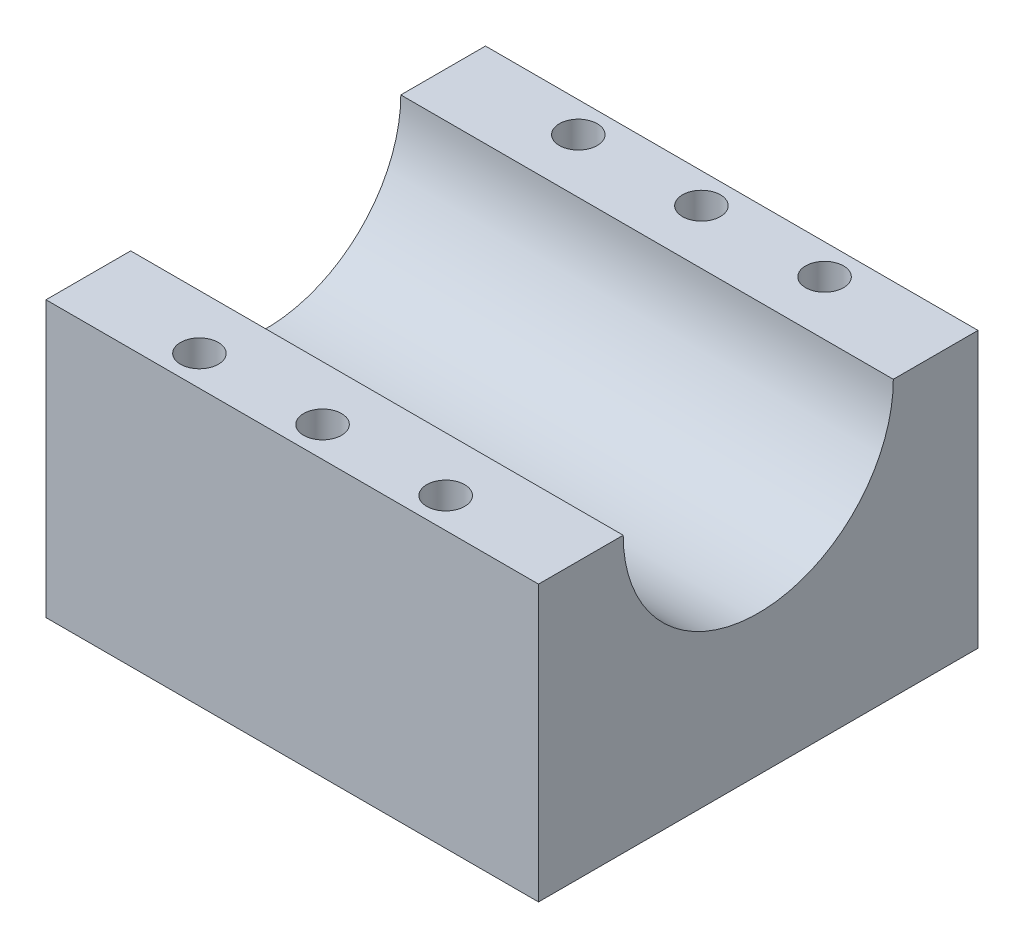
ISO-10303-21;
HEADER;
FILE_DESCRIPTION(('STEP AP214'),'2;1');
FILE_NAME('part.step','',(''),(''),'','','');
FILE_SCHEMA(('AUTOMOTIVE_DESIGN { 1 0 10303 214 1 1 1 1 }'));
ENDSEC;
DATA;
#1=APPLICATION_CONTEXT('core data for automotive mechanical design processes');
#2=APPLICATION_PROTOCOL_DEFINITION('international standard','automotive_design',2000,#1);
#3=PRODUCT_CONTEXT('',#1,'mechanical');
#4=PRODUCT('Part','Part','',(#3));
#5=PRODUCT_RELATED_PRODUCT_CATEGORY('part','',(#4));
#6=PRODUCT_DEFINITION_FORMATION('','',#4);
#7=PRODUCT_DEFINITION_CONTEXT('part definition',#1,'design');
#8=PRODUCT_DEFINITION('design','',#6,#7);
#9=PRODUCT_DEFINITION_SHAPE('','',#8);
#10=(LENGTH_UNIT() NAMED_UNIT(*) SI_UNIT(.MILLI.,.METRE.));
#11=(NAMED_UNIT(*) PLANE_ANGLE_UNIT() SI_UNIT($,.RADIAN.));
#12=(NAMED_UNIT(*) SI_UNIT($,.STERADIAN.) SOLID_ANGLE_UNIT());
#13=UNCERTAINTY_MEASURE_WITH_UNIT(LENGTH_MEASURE(1.E-05),#10,'distance_accuracy_value','');
#14=(GEOMETRIC_REPRESENTATION_CONTEXT(3) GLOBAL_UNCERTAINTY_ASSIGNED_CONTEXT((#13)) GLOBAL_UNIT_ASSIGNED_CONTEXT((#10,
#11,#12)) REPRESENTATION_CONTEXT('',''));
#15=CARTESIAN_POINT('',(0.,0.,0.));
#16=DIRECTION('',(0.,0.,1.));
#17=DIRECTION('',(1.,0.,0.));
#18=AXIS2_PLACEMENT_3D('',#15,#16,#17);
#19=CARTESIAN_POINT('',(0.,36.33,0.));
#20=DIRECTION('',(0.,-1.,0.));
#21=DIRECTION('',(0.,0.,-1.));
#22=AXIS2_PLACEMENT_3D('',#19,#20,#21);
#23=PLANE('',#22);
#24=CARTESIAN_POINT('',(0.,36.33,-25.));
#25=DIRECTION('',(0.,1.,0.));
#26=DIRECTION('',(0.,0.,1.));
#27=AXIS2_PLACEMENT_3D('',#24,#25,#26);
#28=CIRCLE('',#27,2.5);
#29=CARTESIAN_POINT('',(0.,36.33,-22.5));
#30=VERTEX_POINT('',#29);
#31=EDGE_CURVE('E170',#30,#30,#28,.T.);
#32=ORIENTED_EDGE('',*,*,#31,.F.);
#33=EDGE_LOOP('',(#32));
#34=FACE_BOUND('',#33,.T.);
#35=CARTESIAN_POINT('',(16.25,36.33,-25.));
#36=DIRECTION('',(0.,1.,0.));
#37=DIRECTION('',(0.,0.,1.));
#38=AXIS2_PLACEMENT_3D('',#35,#36,#37);
#39=CIRCLE('',#38,2.5);
#40=CARTESIAN_POINT('',(16.25,36.33,-22.5));
#41=VERTEX_POINT('',#40);
#42=EDGE_CURVE('E152',#41,#41,#39,.T.);
#43=ORIENTED_EDGE('',*,*,#42,.F.);
#44=EDGE_LOOP('',(#43));
#45=FACE_BOUND('',#44,.T.);
#46=CARTESIAN_POINT('',(-16.25,36.33,-25.));
#47=DIRECTION('',(0.,1.,0.));
#48=DIRECTION('',(0.,0.,1.));
#49=AXIS2_PLACEMENT_3D('',#46,#47,#48);
#50=CIRCLE('',#49,2.5);
#51=CARTESIAN_POINT('',(-16.25,36.33,-22.5));
#52=VERTEX_POINT('',#51);
#53=EDGE_CURVE('E127',#52,#52,#50,.T.);
#54=ORIENTED_EDGE('',*,*,#53,.F.);
#55=EDGE_LOOP('',(#54));
#56=FACE_BOUND('',#55,.T.);
#57=DIRECTION('',(0.,0.,1.));
#58=VECTOR('',#57,1.);
#59=CARTESIAN_POINT('',(-32.5,36.33,29.));
#60=LINE('',#59,#58);
#61=CARTESIAN_POINT('',(-32.5,36.33,-29.));
#62=VERTEX_POINT('',#61);
#63=CARTESIAN_POINT('',(-32.5,36.33,-17.825));
#64=VERTEX_POINT('',#63);
#65=EDGE_CURVE('E115',#62,#64,#60,.T.);
#66=ORIENTED_EDGE('',*,*,#65,.T.);
#67=DIRECTION('',(1.,0.,0.));
#68=VECTOR('',#67,1.);
#69=CARTESIAN_POINT('',(-32.5,36.33,-17.825));
#70=LINE('',#69,#68);
#71=CARTESIAN_POINT('',(32.5,36.33,-17.825));
#72=VERTEX_POINT('',#71);
#73=EDGE_CURVE('E53',#64,#72,#70,.T.);
#74=ORIENTED_EDGE('',*,*,#73,.T.);
#75=DIRECTION('',(0.,0.,-1.));
#76=VECTOR('',#75,1.);
#77=CARTESIAN_POINT('',(32.5,36.33,29.));
#78=LINE('',#77,#76);
#79=CARTESIAN_POINT('',(32.5,36.33,-29.));
#80=VERTEX_POINT('',#79);
#81=EDGE_CURVE('E89',#72,#80,#78,.T.);
#82=ORIENTED_EDGE('',*,*,#81,.T.);
#83=DIRECTION('',(-1.,0.,0.));
#84=VECTOR('',#83,1.);
#85=CARTESIAN_POINT('',(-32.5,36.33,-29.));
#86=LINE('',#85,#84);
#87=EDGE_CURVE('E116',#80,#62,#86,.T.);
#88=ORIENTED_EDGE('',*,*,#87,.T.);
#89=EDGE_LOOP('',(#66,#74,#82,#88));
#90=FACE_BOUND('',#89,.T.);
#91=ADVANCED_FACE('F38',(#34,#45,#56,#90),#23,.F.);
#92=CARTESIAN_POINT('',(32.5,36.33,29.));
#93=VERTEX_POINT('',#92);
#94=CARTESIAN_POINT('',(32.5,36.33,17.825));
#95=VERTEX_POINT('',#94);
#96=EDGE_CURVE('E110',#93,#95,#78,.T.);
#97=ORIENTED_EDGE('',*,*,#96,.T.);
#98=DIRECTION('',(1.,0.,0.));
#99=VECTOR('',#98,1.);
#100=CARTESIAN_POINT('',(-32.5,36.33,17.825));
#101=LINE('',#100,#99);
#102=CARTESIAN_POINT('',(-32.5,36.33,17.825));
#103=VERTEX_POINT('',#102);
#104=EDGE_CURVE('E99',#95,#103,#101,.F.);
#105=ORIENTED_EDGE('',*,*,#104,.T.);
#106=CARTESIAN_POINT('',(-32.5,36.33,29.));
#107=VERTEX_POINT('',#106);
#108=EDGE_CURVE('E107',#103,#107,#60,.T.);
#109=ORIENTED_EDGE('',*,*,#108,.T.);
#110=DIRECTION('',(1.,0.,0.));
#111=VECTOR('',#110,1.);
#112=CARTESIAN_POINT('',(-32.5,36.33,29.));
#113=LINE('',#112,#111);
#114=EDGE_CURVE('E61',#107,#93,#113,.T.);
#115=ORIENTED_EDGE('',*,*,#114,.T.);
#116=EDGE_LOOP('',(#97,#105,#109,#115));
#117=FACE_BOUND('',#116,.T.);
#118=CARTESIAN_POINT('',(16.25,36.33,25.));
#119=DIRECTION('',(0.,1.,0.));
#120=DIRECTION('',(0.,0.,-1.));
#121=AXIS2_PLACEMENT_3D('',#118,#119,#120);
#122=CIRCLE('',#121,2.5);
#123=CARTESIAN_POINT('',(16.25,36.33,22.5));
#124=VERTEX_POINT('',#123);
#125=EDGE_CURVE('E158',#124,#124,#122,.T.);
#126=ORIENTED_EDGE('',*,*,#125,.F.);
#127=EDGE_LOOP('',(#126));
#128=FACE_BOUND('',#127,.T.);
#129=CARTESIAN_POINT('',(-16.25,36.33,25.));
#130=DIRECTION('',(0.,1.,0.));
#131=DIRECTION('',(0.,0.,-1.));
#132=AXIS2_PLACEMENT_3D('',#129,#130,#131);
#133=CIRCLE('',#132,2.5);
#134=CARTESIAN_POINT('',(-16.25,36.33,22.5));
#135=VERTEX_POINT('',#134);
#136=EDGE_CURVE('E164',#135,#135,#133,.T.);
#137=ORIENTED_EDGE('',*,*,#136,.F.);
#138=EDGE_LOOP('',(#137));
#139=FACE_BOUND('',#138,.T.);
#140=CARTESIAN_POINT('',(0.,36.33,25.));
#141=DIRECTION('',(0.,1.,0.));
#142=DIRECTION('',(0.,0.,1.));
#143=AXIS2_PLACEMENT_3D('',#140,#141,#142);
#144=CIRCLE('',#143,2.5);
#145=CARTESIAN_POINT('',(0.,36.33,27.5));
#146=VERTEX_POINT('',#145);
#147=EDGE_CURVE('E176',#146,#146,#144,.T.);
#148=ORIENTED_EDGE('',*,*,#147,.F.);
#149=EDGE_LOOP('',(#148));
#150=FACE_BOUND('',#149,.T.);
#151=ADVANCED_FACE('F105',(#117,#128,#139,#150),#23,.F.);
#152=CARTESIAN_POINT('',(0.,0.,0.));
#153=DIRECTION('',(0.,-1.,0.));
#154=DIRECTION('',(0.,0.,-1.));
#155=AXIS2_PLACEMENT_3D('',#152,#153,#154);
#156=PLANE('',#155);
#157=CARTESIAN_POINT('',(0.,0.,-25.));
#158=DIRECTION('',(0.,1.,0.));
#159=DIRECTION('',(0.,0.,1.));
#160=AXIS2_PLACEMENT_3D('',#157,#158,#159);
#161=CIRCLE('',#160,2.5);
#162=CARTESIAN_POINT('',(0.,0.,-22.5));
#163=VERTEX_POINT('',#162);
#164=EDGE_CURVE('E173',#163,#163,#161,.T.);
#165=ORIENTED_EDGE('',*,*,#164,.T.);
#166=EDGE_LOOP('',(#165));
#167=FACE_BOUND('',#166,.T.);
#168=CARTESIAN_POINT('',(16.25,0.,25.));
#169=DIRECTION('',(0.,1.,0.));
#170=DIRECTION('',(0.,0.,-1.));
#171=AXIS2_PLACEMENT_3D('',#168,#169,#170);
#172=CIRCLE('',#171,2.5);
#173=CARTESIAN_POINT('',(16.25,0.,22.5));
#174=VERTEX_POINT('',#173);
#175=EDGE_CURVE('E161',#174,#174,#172,.T.);
#176=ORIENTED_EDGE('',*,*,#175,.T.);
#177=EDGE_LOOP('',(#176));
#178=FACE_BOUND('',#177,.T.);
#179=CARTESIAN_POINT('',(-16.25,0.,-25.));
#180=DIRECTION('',(0.,1.,0.));
#181=DIRECTION('',(0.,0.,1.));
#182=AXIS2_PLACEMENT_3D('',#179,#180,#181);
#183=CIRCLE('',#182,2.5);
#184=CARTESIAN_POINT('',(-16.25,0.,-22.5));
#185=VERTEX_POINT('',#184);
#186=EDGE_CURVE('E149',#185,#185,#183,.T.);
#187=ORIENTED_EDGE('',*,*,#186,.T.);
#188=EDGE_LOOP('',(#187));
#189=FACE_BOUND('',#188,.T.);
#190=DIRECTION('',(0.,0.,-1.));
#191=VECTOR('',#190,1.);
#192=CARTESIAN_POINT('',(32.5,0.,29.));
#193=LINE('',#192,#191);
#194=CARTESIAN_POINT('',(32.5,0.,29.));
#195=VERTEX_POINT('',#194);
#196=CARTESIAN_POINT('',(32.5,0.,-29.));
#197=VERTEX_POINT('',#196);
#198=EDGE_CURVE('E123',#195,#197,#193,.T.);
#199=ORIENTED_EDGE('',*,*,#198,.F.);
#200=DIRECTION('',(1.,0.,0.));
#201=VECTOR('',#200,1.);
#202=CARTESIAN_POINT('',(-32.5,0.,29.));
#203=LINE('',#202,#201);
#204=CARTESIAN_POINT('',(-32.5,0.,29.));
#205=VERTEX_POINT('',#204);
#206=EDGE_CURVE('E82',#205,#195,#203,.T.);
#207=ORIENTED_EDGE('',*,*,#206,.F.);
#208=DIRECTION('',(0.,0.,1.));
#209=VECTOR('',#208,1.);
#210=CARTESIAN_POINT('',(-32.5,0.,29.));
#211=LINE('',#210,#209);
#212=CARTESIAN_POINT('',(-32.5,0.,-29.));
#213=VERTEX_POINT('',#212);
#214=EDGE_CURVE('E129',#213,#205,#211,.T.);
#215=ORIENTED_EDGE('',*,*,#214,.F.);
#216=DIRECTION('',(-1.,0.,0.));
#217=VECTOR('',#216,1.);
#218=CARTESIAN_POINT('',(-32.5,0.,-29.));
#219=LINE('',#218,#217);
#220=EDGE_CURVE('E126',#197,#213,#219,.T.);
#221=ORIENTED_EDGE('',*,*,#220,.F.);
#222=EDGE_LOOP('',(#199,#207,#215,#221));
#223=FACE_BOUND('',#222,.T.);
#224=CARTESIAN_POINT('',(16.25,0.,-25.));
#225=DIRECTION('',(0.,1.,0.));
#226=DIRECTION('',(0.,0.,1.));
#227=AXIS2_PLACEMENT_3D('',#224,#225,#226);
#228=CIRCLE('',#227,2.5);
#229=CARTESIAN_POINT('',(16.25,0.,-22.5));
#230=VERTEX_POINT('',#229);
#231=EDGE_CURVE('E155',#230,#230,#228,.T.);
#232=ORIENTED_EDGE('',*,*,#231,.T.);
#233=EDGE_LOOP('',(#232));
#234=FACE_BOUND('',#233,.T.);
#235=CARTESIAN_POINT('',(-16.25,0.,25.));
#236=DIRECTION('',(0.,1.,0.));
#237=DIRECTION('',(0.,0.,-1.));
#238=AXIS2_PLACEMENT_3D('',#235,#236,#237);
#239=CIRCLE('',#238,2.5);
#240=CARTESIAN_POINT('',(-16.25,0.,22.5));
#241=VERTEX_POINT('',#240);
#242=EDGE_CURVE('E167',#241,#241,#239,.T.);
#243=ORIENTED_EDGE('',*,*,#242,.T.);
#244=EDGE_LOOP('',(#243));
#245=FACE_BOUND('',#244,.T.);
#246=CARTESIAN_POINT('',(0.,0.,25.));
#247=DIRECTION('',(0.,1.,0.));
#248=DIRECTION('',(0.,0.,1.));
#249=AXIS2_PLACEMENT_3D('',#246,#247,#248);
#250=CIRCLE('',#249,2.5);
#251=CARTESIAN_POINT('',(0.,0.,27.5));
#252=VERTEX_POINT('',#251);
#253=EDGE_CURVE('E179',#252,#252,#250,.T.);
#254=ORIENTED_EDGE('',*,*,#253,.T.);
#255=EDGE_LOOP('',(#254));
#256=FACE_BOUND('',#255,.T.);
#257=ADVANCED_FACE('F144',(#167,#178,#189,#223,#234,#245,#256),#156,.T.);
#258=CARTESIAN_POINT('',(32.5,36.33,29.));
#259=DIRECTION('',(-1.,0.,0.));
#260=DIRECTION('',(0.,0.,1.));
#261=AXIS2_PLACEMENT_3D('',#258,#259,#260);
#262=PLANE('',#261);
#263=ORIENTED_EDGE('',*,*,#81,.F.);
#264=CARTESIAN_POINT('',(32.5,36.33,0.));
#265=DIRECTION('',(1.,0.,0.));
#266=DIRECTION('',(0.,0.,-1.));
#267=AXIS2_PLACEMENT_3D('',#264,#265,#266);
#268=CIRCLE('',#267,17.825);
#269=EDGE_CURVE('E111',#95,#72,#268,.T.);
#270=ORIENTED_EDGE('',*,*,#269,.F.);
#271=ORIENTED_EDGE('',*,*,#96,.F.);
#272=DIRECTION('',(0.,-1.,0.));
#273=VECTOR('',#272,1.);
#274=CARTESIAN_POINT('',(32.5,36.33,29.));
#275=LINE('',#274,#273);
#276=EDGE_CURVE('E122',#93,#195,#275,.T.);
#277=ORIENTED_EDGE('',*,*,#276,.T.);
#278=ORIENTED_EDGE('',*,*,#198,.T.);
#279=DIRECTION('',(0.,-1.,0.));
#280=VECTOR('',#279,1.);
#281=CARTESIAN_POINT('',(32.5,36.33,-29.));
#282=LINE('',#281,#280);
#283=EDGE_CURVE('E46',#80,#197,#282,.T.);
#284=ORIENTED_EDGE('',*,*,#283,.F.);
#285=EDGE_LOOP('',(#263,#270,#271,#277,#278,#284));
#286=FACE_BOUND('',#285,.T.);
#287=ADVANCED_FACE('F40',(#286),#262,.F.);
#288=CARTESIAN_POINT('',(-32.5,36.33,-29.));
#289=DIRECTION('',(0.,0.,1.));
#290=DIRECTION('',(1.,0.,0.));
#291=AXIS2_PLACEMENT_3D('',#288,#289,#290);
#292=PLANE('',#291);
#293=ORIENTED_EDGE('',*,*,#220,.T.);
#294=DIRECTION('',(0.,-1.,0.));
#295=VECTOR('',#294,1.);
#296=CARTESIAN_POINT('',(-32.5,36.33,-29.));
#297=LINE('',#296,#295);
#298=EDGE_CURVE('E134',#62,#213,#297,.T.);
#299=ORIENTED_EDGE('',*,*,#298,.F.);
#300=ORIENTED_EDGE('',*,*,#87,.F.);
#301=ORIENTED_EDGE('',*,*,#283,.T.);
#302=EDGE_LOOP('',(#293,#299,#300,#301));
#303=FACE_BOUND('',#302,.T.);
#304=ADVANCED_FACE('F139',(#303),#292,.F.);
#305=CARTESIAN_POINT('',(-32.5,36.33,29.));
#306=DIRECTION('',(1.,0.,0.));
#307=DIRECTION('',(0.,0.,-1.));
#308=AXIS2_PLACEMENT_3D('',#305,#306,#307);
#309=PLANE('',#308);
#310=ORIENTED_EDGE('',*,*,#108,.F.);
#311=CARTESIAN_POINT('',(-32.5,36.33,0.));
#312=DIRECTION('',(1.,0.,0.));
#313=DIRECTION('',(0.,0.,-1.));
#314=AXIS2_PLACEMENT_3D('',#311,#312,#313);
#315=CIRCLE('',#314,17.825);
#316=EDGE_CURVE('E11',#103,#64,#315,.T.);
#317=ORIENTED_EDGE('',*,*,#316,.T.);
#318=ORIENTED_EDGE('',*,*,#65,.F.);
#319=ORIENTED_EDGE('',*,*,#298,.T.);
#320=ORIENTED_EDGE('',*,*,#214,.T.);
#321=DIRECTION('',(0.,-1.,0.));
#322=VECTOR('',#321,1.);
#323=CARTESIAN_POINT('',(-32.5,36.33,29.));
#324=LINE('',#323,#322);
#325=EDGE_CURVE('E114',#107,#205,#324,.T.);
#326=ORIENTED_EDGE('',*,*,#325,.F.);
#327=EDGE_LOOP('',(#310,#317,#318,#319,#320,#326));
#328=FACE_BOUND('',#327,.T.);
#329=ADVANCED_FACE('F113',(#328),#309,.F.);
#330=CARTESIAN_POINT('',(-32.5,36.33,29.));
#331=DIRECTION('',(0.,0.,-1.));
#332=DIRECTION('',(-1.,0.,0.));
#333=AXIS2_PLACEMENT_3D('',#330,#331,#332);
#334=PLANE('',#333);
#335=ORIENTED_EDGE('',*,*,#206,.T.);
#336=ORIENTED_EDGE('',*,*,#276,.F.);
#337=ORIENTED_EDGE('',*,*,#114,.F.);
#338=ORIENTED_EDGE('',*,*,#325,.T.);
#339=EDGE_LOOP('',(#335,#336,#337,#338));
#340=FACE_BOUND('',#339,.T.);
#341=ADVANCED_FACE('F147',(#340),#334,.F.);
#342=CARTESIAN_POINT('',(-16.25,36.33,-25.));
#343=DIRECTION('',(0.,-1.,0.));
#344=DIRECTION('',(0.,0.,-1.));
#345=AXIS2_PLACEMENT_3D('',#342,#343,#344);
#346=CYLINDRICAL_SURFACE('',#345,2.5);
#347=ORIENTED_EDGE('',*,*,#53,.T.);
#348=EDGE_LOOP('',(#347));
#349=FACE_BOUND('',#348,.T.);
#350=ORIENTED_EDGE('',*,*,#186,.F.);
#351=EDGE_LOOP('',(#350));
#352=FACE_BOUND('',#351,.T.);
#353=ADVANCED_FACE('F195',(#349,#352),#346,.F.);
#354=CARTESIAN_POINT('',(16.25,36.33,-25.));
#355=DIRECTION('',(0.,-1.,0.));
#356=DIRECTION('',(0.,0.,-1.));
#357=AXIS2_PLACEMENT_3D('',#354,#355,#356);
#358=CYLINDRICAL_SURFACE('',#357,2.5);
#359=ORIENTED_EDGE('',*,*,#42,.T.);
#360=EDGE_LOOP('',(#359));
#361=FACE_BOUND('',#360,.T.);
#362=ORIENTED_EDGE('',*,*,#231,.F.);
#363=EDGE_LOOP('',(#362));
#364=FACE_BOUND('',#363,.T.);
#365=ADVANCED_FACE('F268',(#361,#364),#358,.F.);
#366=CARTESIAN_POINT('',(16.25,36.33,25.));
#367=DIRECTION('',(0.,-1.,0.));
#368=DIRECTION('',(0.,0.,-1.));
#369=AXIS2_PLACEMENT_3D('',#366,#367,#368);
#370=CYLINDRICAL_SURFACE('',#369,2.5);
#371=ORIENTED_EDGE('',*,*,#125,.T.);
#372=EDGE_LOOP('',(#371));
#373=FACE_BOUND('',#372,.T.);
#374=ORIENTED_EDGE('',*,*,#175,.F.);
#375=EDGE_LOOP('',(#374));
#376=FACE_BOUND('',#375,.T.);
#377=ADVANCED_FACE('F257',(#373,#376),#370,.F.);
#378=CARTESIAN_POINT('',(-16.25,36.33,25.));
#379=DIRECTION('',(0.,-1.,0.));
#380=DIRECTION('',(0.,0.,-1.));
#381=AXIS2_PLACEMENT_3D('',#378,#379,#380);
#382=CYLINDRICAL_SURFACE('',#381,2.5);
#383=ORIENTED_EDGE('',*,*,#136,.T.);
#384=EDGE_LOOP('',(#383));
#385=FACE_BOUND('',#384,.T.);
#386=ORIENTED_EDGE('',*,*,#242,.F.);
#387=EDGE_LOOP('',(#386));
#388=FACE_BOUND('',#387,.T.);
#389=ADVANCED_FACE('F246',(#385,#388),#382,.F.);
#390=CARTESIAN_POINT('',(0.,36.33,-25.));
#391=DIRECTION('',(0.,-1.,0.));
#392=DIRECTION('',(0.,0.,-1.));
#393=AXIS2_PLACEMENT_3D('',#390,#391,#392);
#394=CYLINDRICAL_SURFACE('',#393,2.5);
#395=ORIENTED_EDGE('',*,*,#31,.T.);
#396=EDGE_LOOP('',(#395));
#397=FACE_BOUND('',#396,.T.);
#398=ORIENTED_EDGE('',*,*,#164,.F.);
#399=EDGE_LOOP('',(#398));
#400=FACE_BOUND('',#399,.T.);
#401=ADVANCED_FACE('F235',(#397,#400),#394,.F.);
#402=CARTESIAN_POINT('',(0.,36.33,25.));
#403=DIRECTION('',(0.,-1.,0.));
#404=DIRECTION('',(0.,0.,-1.));
#405=AXIS2_PLACEMENT_3D('',#402,#403,#404);
#406=CYLINDRICAL_SURFACE('',#405,2.5);
#407=ORIENTED_EDGE('',*,*,#147,.T.);
#408=EDGE_LOOP('',(#407));
#409=FACE_BOUND('',#408,.T.);
#410=ORIENTED_EDGE('',*,*,#253,.F.);
#411=EDGE_LOOP('',(#410));
#412=FACE_BOUND('',#411,.T.);
#413=ADVANCED_FACE('F230',(#409,#412),#406,.F.);
#414=CARTESIAN_POINT('',(-32.5,36.33,0.));
#415=DIRECTION('',(1.,0.,0.));
#416=DIRECTION('',(0.,0.,-1.));
#417=AXIS2_PLACEMENT_3D('',#414,#415,#416);
#418=CYLINDRICAL_SURFACE('',#417,17.825);
#419=ORIENTED_EDGE('',*,*,#316,.F.);
#420=ORIENTED_EDGE('',*,*,#104,.F.);
#421=ORIENTED_EDGE('',*,*,#269,.T.);
#422=ORIENTED_EDGE('',*,*,#73,.F.);
#423=EDGE_LOOP('',(#419,#420,#421,#422));
#424=FACE_BOUND('',#423,.T.);
#425=ADVANCED_FACE('F98',(#424),#418,.F.);
#426=CLOSED_SHELL('',(#91,#151,#257,#287,#304,#329,#341,#353,#365,#377,#389,#401,#413,#425));
#427=MANIFOLD_SOLID_BREP('B2',#426);
#428=ADVANCED_BREP_SHAPE_REPRESENTATION('',(#18,#427),#14);
#429=SHAPE_DEFINITION_REPRESENTATION(#9,#428);
ENDSEC;
END-ISO-10303-21;
